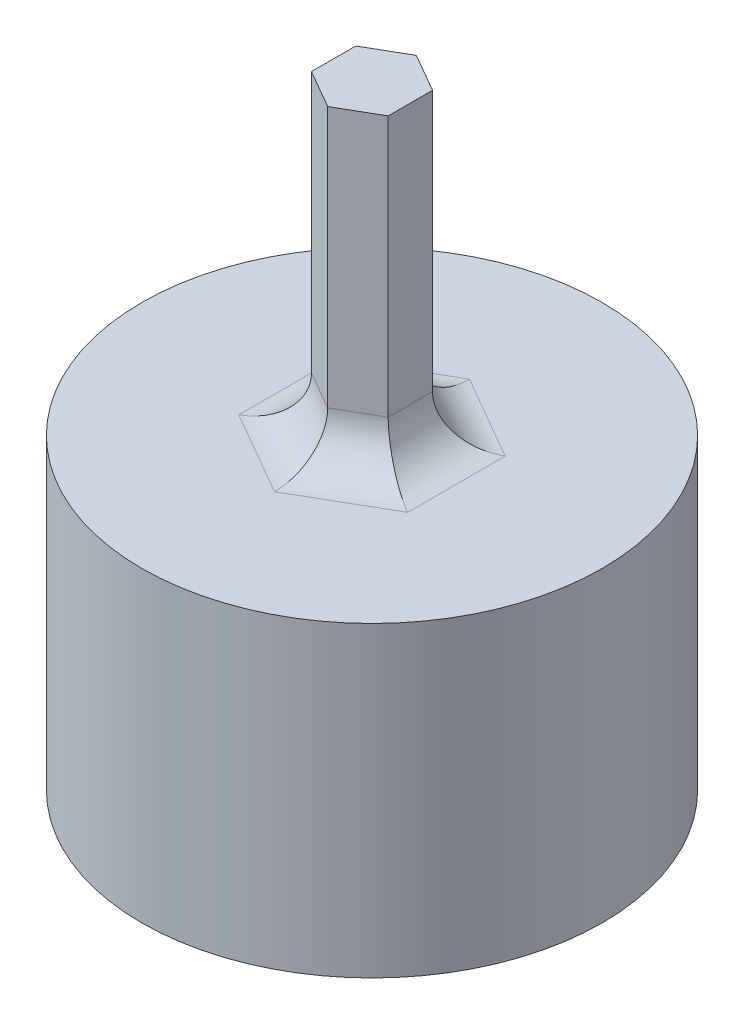
ISO-10303-21;
HEADER;
FILE_DESCRIPTION(('STEP AP214'),'2;1');
FILE_NAME('part.step','',(''),(''),'','','');
FILE_SCHEMA(('AUTOMOTIVE_DESIGN { 1 0 10303 214 1 1 1 1 }'));
ENDSEC;
DATA;
#1=APPLICATION_CONTEXT('core data for automotive mechanical design processes');
#2=APPLICATION_PROTOCOL_DEFINITION('international standard','automotive_design',2000,#1);
#3=PRODUCT_CONTEXT('',#1,'mechanical');
#4=PRODUCT('Part','Part','',(#3));
#5=PRODUCT_RELATED_PRODUCT_CATEGORY('part','',(#4));
#6=PRODUCT_DEFINITION_FORMATION('','',#4);
#7=PRODUCT_DEFINITION_CONTEXT('part definition',#1,'design');
#8=PRODUCT_DEFINITION('design','',#6,#7);
#9=PRODUCT_DEFINITION_SHAPE('','',#8);
#10=(LENGTH_UNIT() NAMED_UNIT(*) SI_UNIT(.MILLI.,.METRE.));
#11=(NAMED_UNIT(*) PLANE_ANGLE_UNIT() SI_UNIT($,.RADIAN.));
#12=(NAMED_UNIT(*) SI_UNIT($,.STERADIAN.) SOLID_ANGLE_UNIT());
#13=UNCERTAINTY_MEASURE_WITH_UNIT(LENGTH_MEASURE(1.E-05),#10,'distance_accuracy_value','');
#14=(GEOMETRIC_REPRESENTATION_CONTEXT(3) GLOBAL_UNCERTAINTY_ASSIGNED_CONTEXT((#13)) GLOBAL_UNIT_ASSIGNED_CONTEXT((#10,
#11,#12)) REPRESENTATION_CONTEXT('',''));
#15=CARTESIAN_POINT('',(0.,0.,0.));
#16=DIRECTION('',(0.,0.,1.));
#17=DIRECTION('',(1.,0.,0.));
#18=AXIS2_PLACEMENT_3D('',#15,#16,#17);
#19=CARTESIAN_POINT('',(0.,0.,0.));
#20=DIRECTION('',(0.,1.,0.));
#21=DIRECTION('',(0.,0.,1.));
#22=AXIS2_PLACEMENT_3D('',#19,#20,#21);
#23=PLANE('',#22);
#24=CARTESIAN_POINT('',(0.,0.,0.));
#25=DIRECTION('',(0.,1.,0.));
#26=DIRECTION('',(0.,0.,1.));
#27=AXIS2_PLACEMENT_3D('',#24,#25,#26);
#28=CIRCLE('',#27,15.);
#29=CARTESIAN_POINT('',(0.,0.,15.));
#30=VERTEX_POINT('',#29);
#31=EDGE_CURVE('E228',#30,#30,#28,.T.);
#32=ORIENTED_EDGE('',*,*,#31,.F.);
#33=EDGE_LOOP('',(#32));
#34=FACE_BOUND('',#33,.T.);
#35=DIRECTION('',(0.,0.,-1.));
#36=VECTOR('',#35,1.);
#37=CARTESIAN_POINT('',(7.5,0.,-7.5));
#38=LINE('',#37,#36);
#39=CARTESIAN_POINT('',(7.5,0.,7.5));
#40=VERTEX_POINT('',#39);
#41=CARTESIAN_POINT('',(7.5,0.,-7.5));
#42=VERTEX_POINT('',#41);
#43=EDGE_CURVE('E171',#40,#42,#38,.T.);
#44=ORIENTED_EDGE('',*,*,#43,.T.);
#45=DIRECTION('',(-1.,0.,0.));
#46=VECTOR('',#45,1.);
#47=CARTESIAN_POINT('',(-7.5,0.,-7.5));
#48=LINE('',#47,#46);
#49=CARTESIAN_POINT('',(-7.5,0.,-7.5));
#50=VERTEX_POINT('',#49);
#51=EDGE_CURVE('E205',#42,#50,#48,.T.);
#52=ORIENTED_EDGE('',*,*,#51,.T.);
#53=DIRECTION('',(0.,0.,1.));
#54=VECTOR('',#53,1.);
#55=CARTESIAN_POINT('',(-7.5,0.,-7.5));
#56=LINE('',#55,#54);
#57=CARTESIAN_POINT('',(-7.5,0.,7.5));
#58=VERTEX_POINT('',#57);
#59=EDGE_CURVE('E206',#50,#58,#56,.T.);
#60=ORIENTED_EDGE('',*,*,#59,.T.);
#61=DIRECTION('',(1.,0.,0.));
#62=VECTOR('',#61,1.);
#63=CARTESIAN_POINT('',(-7.5,0.,7.5));
#64=LINE('',#63,#62);
#65=EDGE_CURVE('E188',#58,#40,#64,.T.);
#66=ORIENTED_EDGE('',*,*,#65,.T.);
#67=EDGE_LOOP('',(#44,#52,#60,#66));
#68=FACE_BOUND('',#67,.T.);
#69=ADVANCED_FACE('F44',(#34,#68),#23,.F.);
#70=CARTESIAN_POINT('',(0.,15.,0.));
#71=DIRECTION('',(0.,-1.,0.));
#72=DIRECTION('',(0.,0.,-1.));
#73=AXIS2_PLACEMENT_3D('',#70,#71,#72);
#74=CYLINDRICAL_SURFACE('',#73,15.);
#75=ORIENTED_EDGE('',*,*,#31,.T.);
#76=EDGE_LOOP('',(#75));
#77=FACE_BOUND('',#76,.T.);
#78=CARTESIAN_POINT('',(0.,20.,0.));
#79=DIRECTION('',(0.,1.,0.));
#80=DIRECTION('',(0.,0.,1.));
#81=AXIS2_PLACEMENT_3D('',#78,#79,#80);
#82=CIRCLE('',#81,15.);
#83=CARTESIAN_POINT('',(0.,20.,15.));
#84=VERTEX_POINT('',#83);
#85=EDGE_CURVE('E168',#84,#84,#82,.T.);
#86=ORIENTED_EDGE('',*,*,#85,.F.);
#87=EDGE_LOOP('',(#86));
#88=FACE_BOUND('',#87,.T.);
#89=ADVANCED_FACE('F342',(#77,#88),#74,.T.);
#90=CARTESIAN_POINT('',(7.5,15.,-7.5));
#91=DIRECTION('',(-1.,0.,0.));
#92=DIRECTION('',(0.,0.,1.));
#93=AXIS2_PLACEMENT_3D('',#90,#91,#92);
#94=PLANE('',#93);
#95=ORIENTED_EDGE('',*,*,#43,.F.);
#96=DIRECTION('',(0.,-1.,0.));
#97=VECTOR('',#96,1.);
#98=CARTESIAN_POINT('',(7.5,15.,7.5));
#99=LINE('',#98,#97);
#100=CARTESIAN_POINT('',(7.5,15.,7.5));
#101=VERTEX_POINT('',#100);
#102=EDGE_CURVE('E196',#101,#40,#99,.T.);
#103=ORIENTED_EDGE('',*,*,#102,.F.);
#104=DIRECTION('',(0.,0.,-1.));
#105=VECTOR('',#104,1.);
#106=CARTESIAN_POINT('',(7.5,15.,-7.5));
#107=LINE('',#106,#105);
#108=CARTESIAN_POINT('',(7.5,15.,-7.5));
#109=VERTEX_POINT('',#108);
#110=EDGE_CURVE('E182',#101,#109,#107,.T.);
#111=ORIENTED_EDGE('',*,*,#110,.T.);
#112=DIRECTION('',(0.,-1.,0.));
#113=VECTOR('',#112,1.);
#114=CARTESIAN_POINT('',(7.5,15.,-7.5));
#115=LINE('',#114,#113);
#116=EDGE_CURVE('E225',#109,#42,#115,.T.);
#117=ORIENTED_EDGE('',*,*,#116,.T.);
#118=EDGE_LOOP('',(#95,#103,#111,#117));
#119=FACE_BOUND('',#118,.T.);
#120=ADVANCED_FACE('F350',(#119),#94,.T.);
#121=CARTESIAN_POINT('',(-7.5,15.,-7.5));
#122=DIRECTION('',(0.,0.,1.));
#123=DIRECTION('',(1.,0.,0.));
#124=AXIS2_PLACEMENT_3D('',#121,#122,#123);
#125=PLANE('',#124);
#126=ORIENTED_EDGE('',*,*,#51,.F.);
#127=ORIENTED_EDGE('',*,*,#116,.F.);
#128=DIRECTION('',(-1.,0.,0.));
#129=VECTOR('',#128,1.);
#130=CARTESIAN_POINT('',(-7.5,15.,-7.5));
#131=LINE('',#130,#129);
#132=CARTESIAN_POINT('',(-7.5,15.,-7.5));
#133=VERTEX_POINT('',#132);
#134=EDGE_CURVE('E183',#109,#133,#131,.T.);
#135=ORIENTED_EDGE('',*,*,#134,.T.);
#136=DIRECTION('',(0.,-1.,0.));
#137=VECTOR('',#136,1.);
#138=CARTESIAN_POINT('',(-7.5,15.,-7.5));
#139=LINE('',#138,#137);
#140=EDGE_CURVE('E218',#133,#50,#139,.T.);
#141=ORIENTED_EDGE('',*,*,#140,.T.);
#142=EDGE_LOOP('',(#126,#127,#135,#141));
#143=FACE_BOUND('',#142,.T.);
#144=ADVANCED_FACE('F500',(#143),#125,.T.);
#145=CARTESIAN_POINT('',(-7.5,15.,-7.5));
#146=DIRECTION('',(1.,0.,0.));
#147=DIRECTION('',(0.,0.,-1.));
#148=AXIS2_PLACEMENT_3D('',#145,#146,#147);
#149=PLANE('',#148);
#150=ORIENTED_EDGE('',*,*,#59,.F.);
#151=ORIENTED_EDGE('',*,*,#140,.F.);
#152=DIRECTION('',(0.,0.,1.));
#153=VECTOR('',#152,1.);
#154=CARTESIAN_POINT('',(-7.5,15.,-7.5));
#155=LINE('',#154,#153);
#156=CARTESIAN_POINT('',(-7.5,15.,7.5));
#157=VERTEX_POINT('',#156);
#158=EDGE_CURVE('E186',#133,#157,#155,.T.);
#159=ORIENTED_EDGE('',*,*,#158,.T.);
#160=DIRECTION('',(0.,-1.,0.));
#161=VECTOR('',#160,1.);
#162=CARTESIAN_POINT('',(-7.5,15.,7.5));
#163=LINE('',#162,#161);
#164=EDGE_CURVE('E216',#157,#58,#163,.T.);
#165=ORIENTED_EDGE('',*,*,#164,.T.);
#166=EDGE_LOOP('',(#150,#151,#159,#165));
#167=FACE_BOUND('',#166,.T.);
#168=ADVANCED_FACE('F490',(#167),#149,.T.);
#169=CARTESIAN_POINT('',(-7.5,15.,7.5));
#170=DIRECTION('',(0.,0.,-1.));
#171=DIRECTION('',(-1.,0.,0.));
#172=AXIS2_PLACEMENT_3D('',#169,#170,#171);
#173=PLANE('',#172);
#174=ORIENTED_EDGE('',*,*,#65,.F.);
#175=ORIENTED_EDGE('',*,*,#164,.F.);
#176=DIRECTION('',(1.,0.,0.));
#177=VECTOR('',#176,1.);
#178=CARTESIAN_POINT('',(-7.5,15.,7.5));
#179=LINE('',#178,#177);
#180=EDGE_CURVE('E191',#157,#101,#179,.T.);
#181=ORIENTED_EDGE('',*,*,#180,.T.);
#182=ORIENTED_EDGE('',*,*,#102,.T.);
#183=EDGE_LOOP('',(#174,#175,#181,#182));
#184=FACE_BOUND('',#183,.T.);
#185=ADVANCED_FACE('F469',(#184),#173,.T.);
#186=CARTESIAN_POINT('',(0.,15.,0.));
#187=DIRECTION('',(0.,1.,0.));
#188=DIRECTION('',(0.,0.,1.));
#189=AXIS2_PLACEMENT_3D('',#186,#187,#188);
#190=PLANE('',#189);
#191=ORIENTED_EDGE('',*,*,#134,.F.);
#192=ORIENTED_EDGE('',*,*,#110,.F.);
#193=ORIENTED_EDGE('',*,*,#180,.F.);
#194=ORIENTED_EDGE('',*,*,#158,.F.);
#195=EDGE_LOOP('',(#191,#192,#193,#194));
#196=FACE_BOUND('',#195,.T.);
#197=ADVANCED_FACE('F459',(#196),#190,.F.);
#198=CARTESIAN_POINT('',(0.,20.,0.));
#199=DIRECTION('',(0.,1.,0.));
#200=DIRECTION('',(0.,0.,1.));
#201=AXIS2_PLACEMENT_3D('',#198,#199,#200);
#202=PLANE('',#201);
#203=DIRECTION('',(0.,0.,1.));
#204=VECTOR('',#203,1.);
#205=CARTESIAN_POINT('',(-5.5,20.,0.));
#206=LINE('',#205,#204);
#207=CARTESIAN_POINT('',(-5.5,20.,3.17542648054294));
#208=VERTEX_POINT('',#207);
#209=CARTESIAN_POINT('',(-5.5,20.,-3.17542648054294));
#210=VERTEX_POINT('',#209);
#211=EDGE_CURVE('E231',#208,#210,#206,.F.);
#212=ORIENTED_EDGE('',*,*,#211,.T.);
#213=DIRECTION('',(-0.866025403784439,0.,0.5));
#214=VECTOR('',#213,1.);
#215=CARTESIAN_POINT('',(-2.75,20.,-4.76313972081441));
#216=LINE('',#215,#214);
#217=CARTESIAN_POINT('',(0.,20.,-6.35085296108589));
#218=VERTEX_POINT('',#217);
#219=EDGE_CURVE('E246',#210,#218,#216,.F.);
#220=ORIENTED_EDGE('',*,*,#219,.T.);
#221=DIRECTION('',(-0.866025403784439,0.,-0.5));
#222=VECTOR('',#221,1.);
#223=CARTESIAN_POINT('',(2.75,20.,-4.76313972081441));
#224=LINE('',#223,#222);
#225=CARTESIAN_POINT('',(5.5,20.,-3.17542648054294));
#226=VERTEX_POINT('',#225);
#227=EDGE_CURVE('E247',#218,#226,#224,.F.);
#228=ORIENTED_EDGE('',*,*,#227,.T.);
#229=DIRECTION('',(0.,0.,-1.));
#230=VECTOR('',#229,1.);
#231=CARTESIAN_POINT('',(5.5,20.,0.));
#232=LINE('',#231,#230);
#233=CARTESIAN_POINT('',(5.5,20.,3.17542648054294));
#234=VERTEX_POINT('',#233);
#235=EDGE_CURVE('E242',#226,#234,#232,.F.);
#236=ORIENTED_EDGE('',*,*,#235,.T.);
#237=DIRECTION('',(0.866025403784439,0.,-0.5));
#238=VECTOR('',#237,1.);
#239=CARTESIAN_POINT('',(2.75,20.,4.76313972081441));
#240=LINE('',#239,#238);
#241=CARTESIAN_POINT('',(0.,20.,6.35085296108589));
#242=VERTEX_POINT('',#241);
#243=EDGE_CURVE('E238',#234,#242,#240,.F.);
#244=ORIENTED_EDGE('',*,*,#243,.T.);
#245=DIRECTION('',(0.866025403784439,0.,0.5));
#246=VECTOR('',#245,1.);
#247=CARTESIAN_POINT('',(-2.75,20.,4.76313972081442));
#248=LINE('',#247,#246);
#249=EDGE_CURVE('E240',#242,#208,#248,.F.);
#250=ORIENTED_EDGE('',*,*,#249,.T.);
#251=EDGE_LOOP('',(#212,#220,#228,#236,#244,#250));
#252=FACE_BOUND('',#251,.T.);
#253=ORIENTED_EDGE('',*,*,#85,.T.);
#254=EDGE_LOOP('',(#253));
#255=FACE_BOUND('',#254,.T.);
#256=ADVANCED_FACE('F295',(#252,#255),#202,.T.);
#257=CARTESIAN_POINT('',(2.5,40.,1.44337567297406));
#258=DIRECTION('',(-1.,0.,0.));
#259=DIRECTION('',(0.,0.,1.));
#260=AXIS2_PLACEMENT_3D('',#257,#258,#259);
#261=PLANE('',#260);
#262=DIRECTION('',(0.,-1.,0.));
#263=VECTOR('',#262,1.);
#264=CARTESIAN_POINT('',(2.5,40.,1.44337567297406));
#265=LINE('',#264,#263);
#266=CARTESIAN_POINT('',(2.5,40.,1.44337567297406));
#267=VERTEX_POINT('',#266);
#268=CARTESIAN_POINT('',(2.5,23.,1.44337567297406));
#269=VERTEX_POINT('',#268);
#270=EDGE_CURVE('E320',#267,#269,#265,.T.);
#271=ORIENTED_EDGE('',*,*,#270,.T.);
#272=DIRECTION('',(0.,0.,-1.));
#273=VECTOR('',#272,1.);
#274=CARTESIAN_POINT('',(2.5,23.,1.44337567297406));
#275=LINE('',#274,#273);
#276=CARTESIAN_POINT('',(2.5,23.,-1.44337567297407));
#277=VERTEX_POINT('',#276);
#278=EDGE_CURVE('E169',#269,#277,#275,.T.);
#279=ORIENTED_EDGE('',*,*,#278,.T.);
#280=DIRECTION('',(0.,-1.,0.));
#281=VECTOR('',#280,1.);
#282=CARTESIAN_POINT('',(2.5,40.,-1.44337567297407));
#283=LINE('',#282,#281);
#284=CARTESIAN_POINT('',(2.5,40.,-1.44337567297407));
#285=VERTEX_POINT('',#284);
#286=EDGE_CURVE('E150',#285,#277,#283,.T.);
#287=ORIENTED_EDGE('',*,*,#286,.F.);
#288=DIRECTION('',(0.,0.,-1.));
#289=VECTOR('',#288,1.);
#290=CARTESIAN_POINT('',(2.5,40.,1.44337567297406));
#291=LINE('',#290,#289);
#292=EDGE_CURVE('E154',#267,#285,#291,.T.);
#293=ORIENTED_EDGE('',*,*,#292,.F.);
#294=EDGE_LOOP('',(#271,#279,#287,#293));
#295=FACE_BOUND('',#294,.T.);
#296=ADVANCED_FACE('F167',(#295),#261,.F.);
#297=CARTESIAN_POINT('',(2.5,40.,-1.44337567297407));
#298=DIRECTION('',(-0.5,0.,0.866025403784439));
#299=DIRECTION('',(0.866025403784439,0.,0.5));
#300=AXIS2_PLACEMENT_3D('',#297,#298,#299);
#301=PLANE('',#300);
#302=ORIENTED_EDGE('',*,*,#286,.T.);
#303=DIRECTION('',(-0.866025403784439,0.,-0.5));
#304=VECTOR('',#303,1.);
#305=CARTESIAN_POINT('',(2.5,23.,-1.44337567297407));
#306=LINE('',#305,#304);
#307=CARTESIAN_POINT('',(0.,23.,-2.88675134594813));
#308=VERTEX_POINT('',#307);
#309=EDGE_CURVE('E251',#277,#308,#306,.T.);
#310=ORIENTED_EDGE('',*,*,#309,.T.);
#311=DIRECTION('',(0.,-1.,0.));
#312=VECTOR('',#311,1.);
#313=CARTESIAN_POINT('',(0.,40.,-2.88675134594813));
#314=LINE('',#313,#312);
#315=CARTESIAN_POINT('',(0.,40.,-2.88675134594813));
#316=VERTEX_POINT('',#315);
#317=EDGE_CURVE('E147',#316,#308,#314,.T.);
#318=ORIENTED_EDGE('',*,*,#317,.F.);
#319=DIRECTION('',(-0.866025403784439,0.,-0.5));
#320=VECTOR('',#319,1.);
#321=CARTESIAN_POINT('',(2.5,40.,-1.44337567297407));
#322=LINE('',#321,#320);
#323=EDGE_CURVE('E141',#285,#316,#322,.T.);
#324=ORIENTED_EDGE('',*,*,#323,.F.);
#325=EDGE_LOOP('',(#302,#310,#318,#324));
#326=FACE_BOUND('',#325,.T.);
#327=ADVANCED_FACE('F144',(#326),#301,.F.);
#328=CARTESIAN_POINT('',(0.,40.,-2.88675134594813));
#329=DIRECTION('',(0.5,0.,0.866025403784438));
#330=DIRECTION('',(0.866025403784439,0.,-0.5));
#331=AXIS2_PLACEMENT_3D('',#328,#329,#330);
#332=PLANE('',#331);
#333=ORIENTED_EDGE('',*,*,#317,.T.);
#334=DIRECTION('',(-0.866025403784439,0.,0.5));
#335=VECTOR('',#334,1.);
#336=CARTESIAN_POINT('',(0.,23.,-2.88675134594813));
#337=LINE('',#336,#335);
#338=CARTESIAN_POINT('',(-2.5,23.,-1.44337567297406));
#339=VERTEX_POINT('',#338);
#340=EDGE_CURVE('E226',#308,#339,#337,.T.);
#341=ORIENTED_EDGE('',*,*,#340,.T.);
#342=DIRECTION('',(0.,-1.,0.));
#343=VECTOR('',#342,1.);
#344=CARTESIAN_POINT('',(-2.5,40.,-1.44337567297406));
#345=LINE('',#344,#343);
#346=CARTESIAN_POINT('',(-2.5,40.,-1.44337567297406));
#347=VERTEX_POINT('',#346);
#348=EDGE_CURVE('E179',#347,#339,#345,.T.);
#349=ORIENTED_EDGE('',*,*,#348,.F.);
#350=DIRECTION('',(-0.866025403784438,0.,0.5));
#351=VECTOR('',#350,1.);
#352=CARTESIAN_POINT('',(0.,40.,-2.88675134594813));
#353=LINE('',#352,#351);
#354=EDGE_CURVE('E152',#316,#347,#353,.T.);
#355=ORIENTED_EDGE('',*,*,#354,.F.);
#356=EDGE_LOOP('',(#333,#341,#349,#355));
#357=FACE_BOUND('',#356,.T.);
#358=ADVANCED_FACE('F305',(#357),#332,.F.);
#359=CARTESIAN_POINT('',(-2.5,40.,-1.44337567297406));
#360=DIRECTION('',(1.,0.,0.));
#361=DIRECTION('',(0.,0.,-1.));
#362=AXIS2_PLACEMENT_3D('',#359,#360,#361);
#363=PLANE('',#362);
#364=ORIENTED_EDGE('',*,*,#348,.T.);
#365=DIRECTION('',(0.,0.,1.));
#366=VECTOR('',#365,1.);
#367=CARTESIAN_POINT('',(-2.5,23.,-1.44337567297406));
#368=LINE('',#367,#366);
#369=CARTESIAN_POINT('',(-2.5,23.,1.44337567297407));
#370=VERTEX_POINT('',#369);
#371=EDGE_CURVE('E11',#339,#370,#368,.T.);
#372=ORIENTED_EDGE('',*,*,#371,.T.);
#373=DIRECTION('',(0.,-1.,0.));
#374=VECTOR('',#373,1.);
#375=CARTESIAN_POINT('',(-2.5,40.,1.44337567297407));
#376=LINE('',#375,#374);
#377=CARTESIAN_POINT('',(-2.5,40.,1.44337567297407));
#378=VERTEX_POINT('',#377);
#379=EDGE_CURVE('E323',#378,#370,#376,.T.);
#380=ORIENTED_EDGE('',*,*,#379,.F.);
#381=DIRECTION('',(0.,0.,1.));
#382=VECTOR('',#381,1.);
#383=CARTESIAN_POINT('',(-2.5,40.,-1.44337567297406));
#384=LINE('',#383,#382);
#385=EDGE_CURVE('E307',#347,#378,#384,.T.);
#386=ORIENTED_EDGE('',*,*,#385,.F.);
#387=EDGE_LOOP('',(#364,#372,#380,#386));
#388=FACE_BOUND('',#387,.T.);
#389=ADVANCED_FACE('F326',(#388),#363,.F.);
#390=CARTESIAN_POINT('',(-2.5,40.,1.44337567297407));
#391=DIRECTION('',(0.5,0.,-0.866025403784439));
#392=DIRECTION('',(-0.866025403784439,0.,-0.5));
#393=AXIS2_PLACEMENT_3D('',#390,#391,#392);
#394=PLANE('',#393);
#395=ORIENTED_EDGE('',*,*,#379,.T.);
#396=DIRECTION('',(0.866025403784439,0.,0.5));
#397=VECTOR('',#396,1.);
#398=CARTESIAN_POINT('',(-2.5,23.,1.44337567297407));
#399=LINE('',#398,#397);
#400=CARTESIAN_POINT('',(0.,23.,2.88675134594813));
#401=VERTEX_POINT('',#400);
#402=EDGE_CURVE('E54',#370,#401,#399,.T.);
#403=ORIENTED_EDGE('',*,*,#402,.T.);
#404=DIRECTION('',(0.,-1.,0.));
#405=VECTOR('',#404,1.);
#406=CARTESIAN_POINT('',(0.,40.,2.88675134594813));
#407=LINE('',#406,#405);
#408=CARTESIAN_POINT('',(0.,40.,2.88675134594813));
#409=VERTEX_POINT('',#408);
#410=EDGE_CURVE('E319',#409,#401,#407,.T.);
#411=ORIENTED_EDGE('',*,*,#410,.F.);
#412=DIRECTION('',(0.866025403784438,0.,0.5));
#413=VECTOR('',#412,1.);
#414=CARTESIAN_POINT('',(-2.5,40.,1.44337567297407));
#415=LINE('',#414,#413);
#416=EDGE_CURVE('E309',#378,#409,#415,.T.);
#417=ORIENTED_EDGE('',*,*,#416,.F.);
#418=EDGE_LOOP('',(#395,#403,#411,#417));
#419=FACE_BOUND('',#418,.T.);
#420=ADVANCED_FACE('F327',(#419),#394,.F.);
#421=CARTESIAN_POINT('',(0.,40.,2.88675134594813));
#422=DIRECTION('',(-0.5,0.,-0.866025403784438));
#423=DIRECTION('',(-0.866025403784439,0.,0.5));
#424=AXIS2_PLACEMENT_3D('',#421,#422,#423);
#425=PLANE('',#424);
#426=ORIENTED_EDGE('',*,*,#410,.T.);
#427=DIRECTION('',(0.866025403784439,0.,-0.5));
#428=VECTOR('',#427,1.);
#429=CARTESIAN_POINT('',(0.,23.,2.88675134594813));
#430=LINE('',#429,#428);
#431=EDGE_CURVE('E256',#401,#269,#430,.T.);
#432=ORIENTED_EDGE('',*,*,#431,.T.);
#433=ORIENTED_EDGE('',*,*,#270,.F.);
#434=DIRECTION('',(0.866025403784438,0.,-0.5));
#435=VECTOR('',#434,1.);
#436=CARTESIAN_POINT('',(0.,40.,2.88675134594813));
#437=LINE('',#436,#435);
#438=EDGE_CURVE('E159',#409,#267,#437,.T.);
#439=ORIENTED_EDGE('',*,*,#438,.F.);
#440=EDGE_LOOP('',(#426,#432,#433,#439));
#441=FACE_BOUND('',#440,.T.);
#442=ADVANCED_FACE('F329',(#441),#425,.F.);
#443=CARTESIAN_POINT('',(0.,40.,0.));
#444=DIRECTION('',(0.,1.,0.));
#445=DIRECTION('',(0.,0.,1.));
#446=AXIS2_PLACEMENT_3D('',#443,#444,#445);
#447=PLANE('',#446);
#448=ORIENTED_EDGE('',*,*,#292,.T.);
#449=ORIENTED_EDGE('',*,*,#323,.T.);
#450=ORIENTED_EDGE('',*,*,#354,.T.);
#451=ORIENTED_EDGE('',*,*,#385,.T.);
#452=ORIENTED_EDGE('',*,*,#416,.T.);
#453=ORIENTED_EDGE('',*,*,#438,.T.);
#454=EDGE_LOOP('',(#448,#449,#450,#451,#452,#453));
#455=FACE_BOUND('',#454,.T.);
#456=ADVANCED_FACE('F158',(#455),#447,.T.);
#457=CARTESIAN_POINT('',(1.5,23.,5.48482755730145));
#458=DIRECTION('',(0.866025403784439,0.,-0.5));
#459=DIRECTION('',(-0.5,0.,-0.866025403784438));
#460=AXIS2_PLACEMENT_3D('',#457,#458,#459);
#461=CYLINDRICAL_SURFACE('',#460,3.);
#462=CARTESIAN_POINT('',(0.,23.,6.35085296108589));
#463=DIRECTION('',(1.,0.,0.));
#464=DIRECTION('',(0.,0.,1.));
#465=AXIS2_PLACEMENT_3D('',#462,#463,#464);
#466=ELLIPSE('',#465,3.46410161513775,3.);
#467=EDGE_CURVE('E277',#242,#401,#466,.T.);
#468=ORIENTED_EDGE('',*,*,#467,.F.);
#469=ORIENTED_EDGE('',*,*,#243,.F.);
#470=CARTESIAN_POINT('',(5.5,23.,3.17542648054294));
#471=DIRECTION('',(0.5,0.,-0.866025403784439));
#472=DIRECTION('',(0.866025403784439,0.,0.5));
#473=AXIS2_PLACEMENT_3D('',#470,#471,#472);
#474=ELLIPSE('',#473,3.46410161513775,3.);
#475=EDGE_CURVE('E47',#269,#234,#474,.F.);
#476=ORIENTED_EDGE('',*,*,#475,.F.);
#477=ORIENTED_EDGE('',*,*,#431,.F.);
#478=EDGE_LOOP('',(#468,#469,#476,#477));
#479=FACE_BOUND('',#478,.T.);
#480=ADVANCED_FACE('F50',(#479),#461,.F.);
#481=CARTESIAN_POINT('',(5.5,23.,1.44337567297406));
#482=DIRECTION('',(0.,0.,-1.));
#483=DIRECTION('',(-1.,0.,0.));
#484=AXIS2_PLACEMENT_3D('',#481,#482,#483);
#485=CYLINDRICAL_SURFACE('',#484,3.);
#486=ORIENTED_EDGE('',*,*,#475,.T.);
#487=ORIENTED_EDGE('',*,*,#235,.F.);
#488=CARTESIAN_POINT('',(5.5,23.,-3.17542648054294));
#489=DIRECTION('',(-0.5,0.,-0.866025403784439));
#490=DIRECTION('',(0.866025403784439,0.,-0.5));
#491=AXIS2_PLACEMENT_3D('',#488,#489,#490);
#492=ELLIPSE('',#491,3.46410161513775,3.);
#493=EDGE_CURVE('E272',#277,#226,#492,.F.);
#494=ORIENTED_EDGE('',*,*,#493,.F.);
#495=ORIENTED_EDGE('',*,*,#278,.F.);
#496=EDGE_LOOP('',(#486,#487,#494,#495));
#497=FACE_BOUND('',#496,.T.);
#498=ADVANCED_FACE('F289',(#497),#485,.F.);
#499=CARTESIAN_POINT('',(-4.,23.,4.04145188432738));
#500=DIRECTION('',(0.866025403784439,0.,0.5));
#501=DIRECTION('',(0.5,0.,-0.866025403784439));
#502=AXIS2_PLACEMENT_3D('',#499,#500,#501);
#503=CYLINDRICAL_SURFACE('',#502,3.);
#504=ORIENTED_EDGE('',*,*,#467,.T.);
#505=ORIENTED_EDGE('',*,*,#402,.F.);
#506=CARTESIAN_POINT('',(-5.5,23.,3.17542648054294));
#507=DIRECTION('',(0.5,0.,0.866025403784439));
#508=DIRECTION('',(-0.866025403784439,0.,0.5));
#509=AXIS2_PLACEMENT_3D('',#506,#507,#508);
#510=ELLIPSE('',#509,3.46410161513775,3.);
#511=EDGE_CURVE('E267',#208,#370,#510,.T.);
#512=ORIENTED_EDGE('',*,*,#511,.F.);
#513=ORIENTED_EDGE('',*,*,#249,.F.);
#514=EDGE_LOOP('',(#504,#505,#512,#513));
#515=FACE_BOUND('',#514,.T.);
#516=ADVANCED_FACE('F364',(#515),#503,.F.);
#517=CARTESIAN_POINT('',(4.,23.,-4.04145188432738));
#518=DIRECTION('',(-0.866025403784439,0.,-0.5));
#519=DIRECTION('',(-0.5,0.,0.866025403784439));
#520=AXIS2_PLACEMENT_3D('',#517,#518,#519);
#521=CYLINDRICAL_SURFACE('',#520,3.);
#522=ORIENTED_EDGE('',*,*,#493,.T.);
#523=ORIENTED_EDGE('',*,*,#227,.F.);
#524=CARTESIAN_POINT('',(0.,23.,-6.35085296108589));
#525=DIRECTION('',(-1.,0.,0.));
#526=DIRECTION('',(0.,0.,-1.));
#527=AXIS2_PLACEMENT_3D('',#524,#525,#526);
#528=ELLIPSE('',#527,3.46410161513775,3.);
#529=EDGE_CURVE('E266',#308,#218,#528,.F.);
#530=ORIENTED_EDGE('',*,*,#529,.F.);
#531=ORIENTED_EDGE('',*,*,#309,.F.);
#532=EDGE_LOOP('',(#522,#523,#530,#531));
#533=FACE_BOUND('',#532,.T.);
#534=ADVANCED_FACE('F300',(#533),#521,.F.);
#535=CARTESIAN_POINT('',(-5.5,23.,-1.44337567297406));
#536=DIRECTION('',(0.,0.,1.));
#537=DIRECTION('',(1.,0.,0.));
#538=AXIS2_PLACEMENT_3D('',#535,#536,#537);
#539=CYLINDRICAL_SURFACE('',#538,3.);
#540=ORIENTED_EDGE('',*,*,#511,.T.);
#541=ORIENTED_EDGE('',*,*,#371,.F.);
#542=CARTESIAN_POINT('',(-5.5,23.,-3.17542648054294));
#543=DIRECTION('',(-0.5,0.,0.866025403784439));
#544=DIRECTION('',(0.866025403784439,0.,0.5));
#545=AXIS2_PLACEMENT_3D('',#542,#543,#544);
#546=ELLIPSE('',#545,3.46410161513775,3.);
#547=EDGE_CURVE('E263',#210,#339,#546,.T.);
#548=ORIENTED_EDGE('',*,*,#547,.F.);
#549=ORIENTED_EDGE('',*,*,#211,.F.);
#550=EDGE_LOOP('',(#540,#541,#548,#549));
#551=FACE_BOUND('',#550,.T.);
#552=ADVANCED_FACE('F360',(#551),#539,.F.);
#553=CARTESIAN_POINT('',(-1.5,23.,-5.48482755730145));
#554=DIRECTION('',(-0.866025403784439,0.,0.5));
#555=DIRECTION('',(0.5,0.,0.866025403784438));
#556=AXIS2_PLACEMENT_3D('',#553,#554,#555);
#557=CYLINDRICAL_SURFACE('',#556,3.);
#558=ORIENTED_EDGE('',*,*,#529,.T.);
#559=ORIENTED_EDGE('',*,*,#219,.F.);
#560=ORIENTED_EDGE('',*,*,#547,.T.);
#561=ORIENTED_EDGE('',*,*,#340,.F.);
#562=EDGE_LOOP('',(#558,#559,#560,#561));
#563=FACE_BOUND('',#562,.T.);
#564=ADVANCED_FACE('F351',(#563),#557,.F.);
#565=CLOSED_SHELL('',(#69,#89,#120,#144,#168,#185,#197,#256,#296,#327,#358,#389,#420,#442,#456,
#480,#498,#516,#534,#552,#564));
#566=MANIFOLD_SOLID_BREP('B2',#565);
#567=ADVANCED_BREP_SHAPE_REPRESENTATION('',(#18,#566),#14);
#568=SHAPE_DEFINITION_REPRESENTATION(#9,#567);
ENDSEC;
END-ISO-10303-21;
